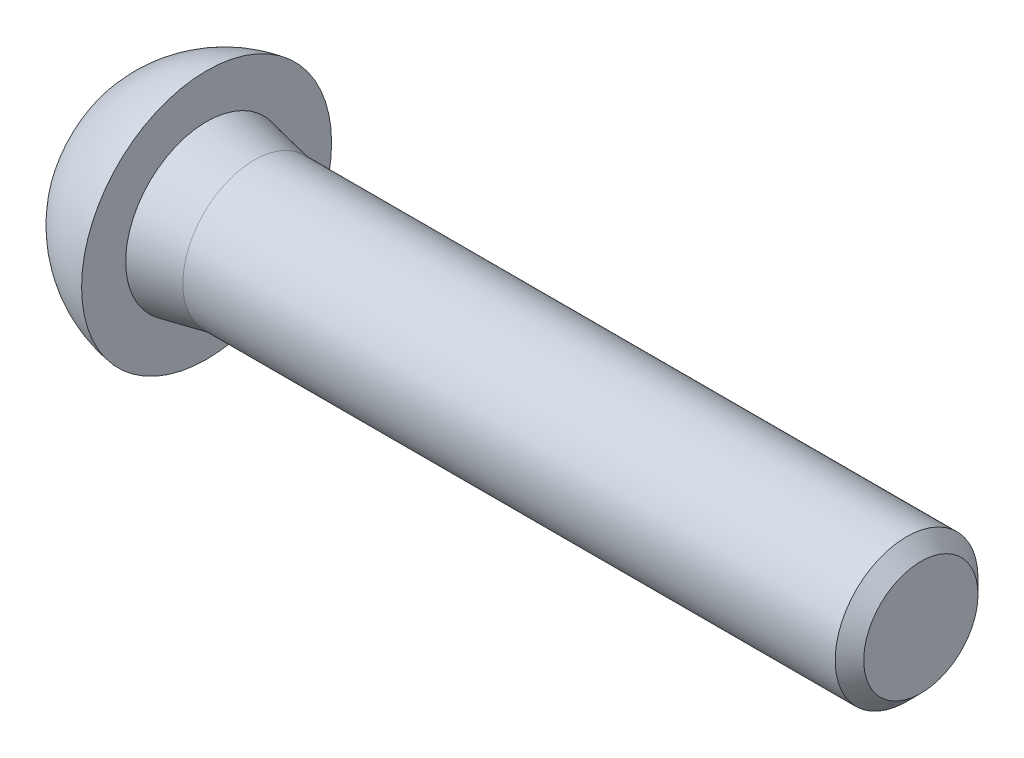
ISO-10303-21;
HEADER;
FILE_DESCRIPTION(('STEP AP214'),'2;1');
FILE_NAME('part.step','',(''),(''),'','','');
FILE_SCHEMA(('AUTOMOTIVE_DESIGN { 1 0 10303 214 1 1 1 1 }'));
ENDSEC;
DATA;
#1=APPLICATION_CONTEXT('core data for automotive mechanical design processes');
#2=APPLICATION_PROTOCOL_DEFINITION('international standard','automotive_design',2000,#1);
#3=PRODUCT_CONTEXT('',#1,'mechanical');
#4=PRODUCT('Part','Part','',(#3));
#5=PRODUCT_RELATED_PRODUCT_CATEGORY('part','',(#4));
#6=PRODUCT_DEFINITION_FORMATION('','',#4);
#7=PRODUCT_DEFINITION_CONTEXT('part definition',#1,'design');
#8=PRODUCT_DEFINITION('design','',#6,#7);
#9=PRODUCT_DEFINITION_SHAPE('','',#8);
#10=(LENGTH_UNIT() NAMED_UNIT(*) SI_UNIT(.MILLI.,.METRE.));
#11=(NAMED_UNIT(*) PLANE_ANGLE_UNIT() SI_UNIT($,.RADIAN.));
#12=(NAMED_UNIT(*) SI_UNIT($,.STERADIAN.) SOLID_ANGLE_UNIT());
#13=UNCERTAINTY_MEASURE_WITH_UNIT(LENGTH_MEASURE(1.E-05),#10,'distance_accuracy_value','');
#14=(GEOMETRIC_REPRESENTATION_CONTEXT(3) GLOBAL_UNCERTAINTY_ASSIGNED_CONTEXT((#13)) GLOBAL_UNIT_ASSIGNED_CONTEXT((#10,
#11,#12)) REPRESENTATION_CONTEXT('',''));
#15=CARTESIAN_POINT('',(0.,0.,0.));
#16=DIRECTION('',(0.,0.,1.));
#17=DIRECTION('',(1.,0.,0.));
#18=AXIS2_PLACEMENT_3D('',#15,#16,#17);
#19=CARTESIAN_POINT('',(0.,0.,0.));
#20=DIRECTION('',(1.,0.,0.));
#21=DIRECTION('',(0.,0.,-1.));
#22=AXIS2_PLACEMENT_3D('',#19,#20,#21);
#23=PLANE('',#22);
#24=CARTESIAN_POINT('',(0.,0.,0.));
#25=DIRECTION('',(1.,0.,0.));
#26=DIRECTION('',(0.,0.,-1.));
#27=AXIS2_PLACEMENT_3D('',#24,#25,#26);
#28=CIRCLE('',#27,2.4);
#29=CARTESIAN_POINT('',(0.,0.,-2.4));
#30=VERTEX_POINT('',#29);
#31=EDGE_CURVE('E68',#30,#30,#28,.T.);
#32=ORIENTED_EDGE('',*,*,#31,.T.);
#33=EDGE_LOOP('',(#32));
#34=FACE_BOUND('',#33,.T.);
#35=ADVANCED_FACE('F57',(#34),#23,.T.);
#36=CARTESIAN_POINT('',(0.,0.,0.));
#37=DIRECTION('',(1.,0.,0.));
#38=DIRECTION('',(0.,0.,-1.));
#39=AXIS2_PLACEMENT_3D('',#36,#37,#38);
#40=CYLINDRICAL_SURFACE('',#39,3.);
#41=CARTESIAN_POINT('',(-0.599999999999999,0.,0.));
#42=DIRECTION('',(1.,0.,0.));
#43=DIRECTION('',(0.,0.,-1.));
#44=AXIS2_PLACEMENT_3D('',#41,#42,#43);
#45=CIRCLE('',#44,3.);
#46=CARTESIAN_POINT('',(-0.599999999999999,0.,-3.));
#47=VERTEX_POINT('',#46);
#48=EDGE_CURVE('E12',#47,#47,#45,.F.);
#49=ORIENTED_EDGE('',*,*,#48,.T.);
#50=EDGE_LOOP('',(#49));
#51=FACE_BOUND('',#50,.T.);
#52=CARTESIAN_POINT('',(-28.,0.,0.));
#53=DIRECTION('',(1.,0.,0.));
#54=DIRECTION('',(0.,0.,-1.));
#55=AXIS2_PLACEMENT_3D('',#52,#53,#54);
#56=CIRCLE('',#55,3.);
#57=CARTESIAN_POINT('',(-28.,0.,-3.));
#58=VERTEX_POINT('',#57);
#59=EDGE_CURVE('E185',#58,#58,#56,.T.);
#60=ORIENTED_EDGE('',*,*,#59,.T.);
#61=EDGE_LOOP('',(#60));
#62=FACE_BOUND('',#61,.T.);
#63=ADVANCED_FACE('F274',(#51,#62),#40,.T.);
#64=CARTESIAN_POINT('',(-28.,0.,0.));
#65=DIRECTION('',(-1.,0.,0.));
#66=DIRECTION('',(0.,0.,1.));
#67=AXIS2_PLACEMENT_3D('',#64,#65,#66);
#68=CONICAL_SURFACE('',#67,3.,0.197395559849881);
#69=CARTESIAN_POINT('',(-30.,0.,0.));
#70=DIRECTION('',(1.,0.,0.));
#71=DIRECTION('',(0.,0.,-1.));
#72=AXIS2_PLACEMENT_3D('',#69,#70,#71);
#73=CIRCLE('',#72,3.4);
#74=CARTESIAN_POINT('',(-30.,0.,-3.4));
#75=VERTEX_POINT('',#74);
#76=EDGE_CURVE('E181',#75,#75,#73,.T.);
#77=ORIENTED_EDGE('',*,*,#76,.T.);
#78=EDGE_LOOP('',(#77));
#79=FACE_BOUND('',#78,.T.);
#80=ORIENTED_EDGE('',*,*,#59,.F.);
#81=EDGE_LOOP('',(#80));
#82=FACE_BOUND('',#81,.T.);
#83=ADVANCED_FACE('F279',(#79,#82),#68,.T.);
#84=CARTESIAN_POINT('',(-30.,3.4,0.));
#85=DIRECTION('',(1.,0.,0.));
#86=DIRECTION('',(0.,0.,-1.));
#87=AXIS2_PLACEMENT_3D('',#84,#85,#86);
#88=PLANE('',#87);
#89=CARTESIAN_POINT('',(-30.,0.,0.));
#90=DIRECTION('',(1.,0.,0.));
#91=DIRECTION('',(0.,0.,-1.));
#92=AXIS2_PLACEMENT_3D('',#89,#90,#91);
#93=CIRCLE('',#92,5.25);
#94=CARTESIAN_POINT('',(-30.,5.24999999999999,0.));
#95=VERTEX_POINT('',#94);
#96=EDGE_CURVE('E177',#95,#95,#93,.T.);
#97=ORIENTED_EDGE('',*,*,#96,.T.);
#98=EDGE_LOOP('',(#97));
#99=FACE_BOUND('',#98,.T.);
#100=ORIENTED_EDGE('',*,*,#76,.F.);
#101=EDGE_LOOP('',(#100));
#102=FACE_BOUND('',#101,.T.);
#103=ADVANCED_FACE('F285',(#99,#102),#88,.T.);
#104=CARTESIAN_POINT('',(-29.2460454545455,0.,0.));
#105=DIRECTION('',(1.,0.,0.));
#106=DIRECTION('',(0.,1.,0.));
#107=AXIS2_PLACEMENT_3D('',#104,#105,#106);
#108=SPHERICAL_SURFACE('',#107,5.30386156084522);
#109=CARTESIAN_POINT('',(-33.3,0.,0.));
#110=DIRECTION('',(1.,0.,0.));
#111=DIRECTION('',(0.,0.,-1.));
#112=AXIS2_PLACEMENT_3D('',#109,#110,#111);
#113=CIRCLE('',#112,3.42);
#114=CARTESIAN_POINT('',(-33.3,3.41999999999999,0.));
#115=VERTEX_POINT('',#114);
#116=EDGE_CURVE('E136',#115,#115,#113,.T.);
#117=CARTESIAN_POINT('',(-33.3,3.41999999999999,0.));
#118=CARTESIAN_POINT('',(-33.2740870694515,3.45071645963646,0.));
#119=CARTESIAN_POINT('',(-33.2478249112314,3.48113829921276,0.));
#120=CARTESIAN_POINT('',(-33.1946159870787,3.54137726683391,0.));
#121=CARTESIAN_POINT('',(-33.1676692211461,3.57119439487874,0.));
#122=CARTESIAN_POINT('',(-33.1131049291991,3.6302084680258,0.));
#123=CARTESIAN_POINT('',(-33.0854874031847,3.65940541312801,0.));
#124=CARTESIAN_POINT('',(-33.0295958800378,3.71716405311965,0.));
#125=CARTESIAN_POINT('',(-33.0013218829053,3.74572574800908,0.));
#126=CARTESIAN_POINT('',(-32.9441320202645,3.80219912608321,0.));
#127=CARTESIAN_POINT('',(-32.9152161547562,3.83011080926792,0.));
#128=CARTESIAN_POINT('',(-32.8567574965401,3.8852697442878,0.));
#129=CARTESIAN_POINT('',(-32.8272147038322,3.91251699612297,0.));
#130=CARTESIAN_POINT('',(-32.7675174544793,3.96633299047506,0.));
#131=CARTESIAN_POINT('',(-32.7373629978344,3.99290173299198,0.));
#132=CARTESIAN_POINT('',(-32.6764580003821,4.04534698173061,0.));
#133=CARTESIAN_POINT('',(-32.6457074595749,4.07122348795232,0.));
#134=CARTESIAN_POINT('',(-32.5836261814162,4.12227089466032,0.));
#135=CARTESIAN_POINT('',(-32.5522954440647,4.14744179514662,0.));
#136=CARTESIAN_POINT('',(-32.4890699602365,4.1970649855345,0.));
#137=CARTESIAN_POINT('',(-32.4571752137598,4.22151727543608,0.));
#138=CARTESIAN_POINT('',(-32.3928381904927,4.26969061107593,0.));
#139=CARTESIAN_POINT('',(-32.3603959137024,4.2934116568142,0.));
#140=CARTESIAN_POINT('',(-32.2949805915108,4.34011024835735,0.));
#141=CARTESIAN_POINT('',(-32.2620075461095,4.36308779416223,0.));
#142=CARTESIAN_POINT('',(-32.1955477226258,4.40828751420635,0.));
#143=CARTESIAN_POINT('',(-32.1620609445435,4.43050968844559,0.));
#144=CARTESIAN_POINT('',(-32.0945909570544,4.47418718399834,0.));
#145=CARTESIAN_POINT('',(-32.0606077476476,4.49564250531186,0.));
#146=CARTESIAN_POINT('',(-31.9921624553533,4.53777520985705,0.));
#147=CARTESIAN_POINT('',(-31.9577003724658,4.55845259308873,0.));
#148=CARTESIAN_POINT('',(-31.8883151384699,4.59901873824546,0.));
#149=CARTESIAN_POINT('',(-31.8533919873614,4.61890750017051,0.));
#150=CARTESIAN_POINT('',(-31.7831026603999,4.65788612694008,0.));
#151=CARTESIAN_POINT('',(-31.7477364845468,4.67697599178461,0.));
#152=CARTESIAN_POINT('',(-31.6765793804665,4.71434696137926,0.));
#153=CARTESIAN_POINT('',(-31.6407884522392,4.73262806612939,0.));
#154=CARTESIAN_POINT('',(-31.5688003352346,4.76837207037724,0.));
#155=CARTESIAN_POINT('',(-31.5326031464572,4.78583496987497,0.));
#156=CARTESIAN_POINT('',(-31.4598212100758,4.81993354119586,0.));
#157=CARTESIAN_POINT('',(-31.4232364624719,4.83656921301902,0.));
#158=CARTESIAN_POINT('',(-31.3496983103979,4.86900473396591,0.));
#159=CARTESIAN_POINT('',(-31.312744905928,4.88480458308965,0.));
#160=CARTESIAN_POINT('',(-31.2384885325538,4.91556029545116,0.));
#161=CARTESIAN_POINT('',(-31.2011855636496,4.93051615868894,0.));
#162=CARTESIAN_POINT('',(-31.1262493344453,4.95957617214685,0.));
#163=CARTESIAN_POINT('',(-31.0886160741452,4.97368032236697,0.));
#164=CARTESIAN_POINT('',(-31.0130387058371,5.00102962270919,0.));
#165=CARTESIAN_POINT('',(-30.9750945978292,5.01427477283129,0.));
#166=CARTESIAN_POINT('',(-30.8989151383947,5.03989922969769,0.));
#167=CARTESIAN_POINT('',(-30.8606797869681,5.05227853644201,0.));
#168=CARTESIAN_POINT('',(-30.783937595468,5.07616491066791,0.));
#169=CARTESIAN_POINT('',(-30.7454307553943,5.0876719781495,0.));
#170=CARTESIAN_POINT('',(-30.6681654816105,5.10980792844588,0.));
#171=CARTESIAN_POINT('',(-30.6294070479005,5.12043681126069,0.));
#172=CARTESIAN_POINT('',(-30.5516586119508,5.14081090118732,0.));
#173=CARTESIAN_POINT('',(-30.5126686097112,5.15055610829916,0.));
#174=CARTESIAN_POINT('',(-30.4344771810517,5.16915780994609,0.));
#175=CARTESIAN_POINT('',(-30.3952757546318,5.17801430448119,0.));
#176=CARTESIAN_POINT('',(-30.3166817326903,5.19483401222037,0.));
#177=CARTESIAN_POINT('',(-30.2772891371688,5.20279722542446,0.));
#178=CARTESIAN_POINT('',(-30.1983331252948,5.21782622985083,0.));
#179=CARTESIAN_POINT('',(-30.1587697089424,5.22489202107312,0.));
#180=CARTESIAN_POINT('',(-30.0794925127506,5.23812262927939,0.));
#181=CARTESIAN_POINT('',(-30.0397787329111,5.24428744626339,0.));
#182=CARTESIAN_POINT('',(-30.,5.24999999999999,0.));
#183=B_SPLINE_CURVE_WITH_KNOTS('',3,(#117,#118,#119,#120,#121,#122,#123,#124,#125,#126,#127,
#128,#129,#130,#131,#132,#133,#134,#135,#136,#137,#138,#139,#140,#141,#142,#143,#144,#145,#146,
#147,#148,#149,#150,#151,#152,#153,#154,#155,#156,#157,#158,#159,#160,#161,#162,#163,#164,#165,
#166,#167,#168,#169,#170,#171,#172,#173,#174,#175,#176,#177,#178,#179,#180,#181,#182),
.UNSPECIFIED.,.F.,.F.,(4,2,2,2,2,2,2,2,2,2,2,2,2,2,2,2,2,2,2,2,2,2,2,2,2,2,2,2,2,2,2,2,4),(0.,
0.120557872383619,0.241115744767231,0.361673617150846,0.48223148953446,0.602789361918079,
0.723347234301694,0.843905106685309,0.964462979068919,1.08502085145253,1.20557872383615,
1.32613659621977,1.44669446860338,1.567252340987,1.68781021337061,1.80836808575423,
1.92892595813784,2.04948383052146,2.17004170290507,2.29059957528869,2.4111574476723,
2.53171532005592,2.65227319243953,2.77283106482314,2.89338893720676,3.01394680959038,
3.13450468197399,3.25506255435761,3.37562042674122,3.49617829912484,3.61673617150845,
3.73729404389207,3.85785191627568),.UNSPECIFIED.);
#184=EDGE_CURVE('BSEAM289',#115,#95,#183,.T.);
#185=ORIENTED_EDGE('',*,*,#116,.T.);
#186=ORIENTED_EDGE('',*,*,#96,.F.);
#187=ORIENTED_EDGE('',*,*,#184,.T.);
#188=ORIENTED_EDGE('',*,*,#184,.F.);
#189=EDGE_LOOP('',(#185,#187,#186,#188));
#190=FACE_BOUND('',#189,.T.);
#191=ADVANCED_FACE('F289',(#190),#108,.T.);
#192=CARTESIAN_POINT('',(-33.3,3.42,0.));
#193=DIRECTION('',(-1.,0.,0.));
#194=DIRECTION('',(0.,0.,1.));
#195=AXIS2_PLACEMENT_3D('',#192,#193,#194);
#196=PLANE('',#195);
#197=DIRECTION('',(0.,0.5,-0.866025403784439));
#198=VECTOR('',#197,1.);
#199=CARTESIAN_POINT('',(-33.3,1.15470053837925,2.));
#200=LINE('',#199,#198);
#201=CARTESIAN_POINT('',(-33.3,1.15470053837925,2.));
#202=VERTEX_POINT('',#201);
#203=CARTESIAN_POINT('',(-33.3,2.3094010767585,0.));
#204=VERTEX_POINT('',#203);
#205=EDGE_CURVE('E77',#202,#204,#200,.T.);
#206=ORIENTED_EDGE('',*,*,#205,.F.);
#207=DIRECTION('',(0.,1.,0.));
#208=VECTOR('',#207,1.);
#209=CARTESIAN_POINT('',(-33.3,-1.15470053837925,2.));
#210=LINE('',#209,#208);
#211=CARTESIAN_POINT('',(-33.3,-1.15470053837925,2.));
#212=VERTEX_POINT('',#211);
#213=EDGE_CURVE('E139',#212,#202,#210,.T.);
#214=ORIENTED_EDGE('',*,*,#213,.F.);
#215=DIRECTION('',(0.,0.5,0.866025403784439));
#216=VECTOR('',#215,1.);
#217=CARTESIAN_POINT('',(-33.3,-2.3094010767585,0.));
#218=LINE('',#217,#216);
#219=CARTESIAN_POINT('',(-33.3,-2.3094010767585,0.));
#220=VERTEX_POINT('',#219);
#221=EDGE_CURVE('E144',#220,#212,#218,.T.);
#222=ORIENTED_EDGE('',*,*,#221,.F.);
#223=DIRECTION('',(0.,-0.5,0.866025403784439));
#224=VECTOR('',#223,1.);
#225=CARTESIAN_POINT('',(-33.3,-1.15470053837925,-2.));
#226=LINE('',#225,#224);
#227=CARTESIAN_POINT('',(-33.3,-1.15470053837925,-2.));
#228=VERTEX_POINT('',#227);
#229=EDGE_CURVE('E168',#228,#220,#226,.T.);
#230=ORIENTED_EDGE('',*,*,#229,.F.);
#231=DIRECTION('',(0.,-1.,0.));
#232=VECTOR('',#231,1.);
#233=CARTESIAN_POINT('',(-33.3,1.15470053837925,-2.));
#234=LINE('',#233,#232);
#235=CARTESIAN_POINT('',(-33.3,1.15470053837925,-2.));
#236=VERTEX_POINT('',#235);
#237=EDGE_CURVE('E159',#236,#228,#234,.T.);
#238=ORIENTED_EDGE('',*,*,#237,.F.);
#239=DIRECTION('',(0.,-0.5,-0.866025403784439));
#240=VECTOR('',#239,1.);
#241=CARTESIAN_POINT('',(-33.3,2.3094010767585,0.));
#242=LINE('',#241,#240);
#243=EDGE_CURVE('E151',#204,#236,#242,.T.);
#244=ORIENTED_EDGE('',*,*,#243,.F.);
#245=EDGE_LOOP('',(#206,#214,#222,#230,#238,#244));
#246=FACE_BOUND('',#245,.T.);
#247=ORIENTED_EDGE('',*,*,#116,.F.);
#248=EDGE_LOOP('',(#247));
#249=FACE_BOUND('',#248,.T.);
#250=ADVANCED_FACE('F147',(#246,#249),#196,.T.);
#251=CARTESIAN_POINT('',(-31.22,1.15470053837925,2.));
#252=DIRECTION('',(0.,0.866025403784439,0.5));
#253=DIRECTION('',(0.,-0.5,0.866025403784439));
#254=AXIS2_PLACEMENT_3D('',#251,#252,#253);
#255=PLANE('',#254);
#256=ORIENTED_EDGE('',*,*,#205,.T.);
#257=DIRECTION('',(-1.,0.,0.));
#258=VECTOR('',#257,1.);
#259=CARTESIAN_POINT('',(-31.22,2.3094010767585,0.));
#260=LINE('',#259,#258);
#261=CARTESIAN_POINT('',(-31.22,2.3094010767585,0.));
#262=VERTEX_POINT('',#261);
#263=EDGE_CURVE('E195',#262,#204,#260,.T.);
#264=ORIENTED_EDGE('',*,*,#263,.F.);
#265=DIRECTION('',(0.,-0.5,0.866025403784438));
#266=VECTOR('',#265,1.);
#267=CARTESIAN_POINT('',(-31.22,2.3094010767585,0.));
#268=LINE('',#267,#266);
#269=CARTESIAN_POINT('',(-31.22,1.15470053837925,2.));
#270=VERTEX_POINT('',#269);
#271=EDGE_CURVE('E61',#270,#262,#268,.F.);
#272=ORIENTED_EDGE('',*,*,#271,.F.);
#273=DIRECTION('',(-1.,0.,0.));
#274=VECTOR('',#273,1.);
#275=CARTESIAN_POINT('',(-31.22,1.15470053837925,2.));
#276=LINE('',#275,#274);
#277=EDGE_CURVE('E133',#270,#202,#276,.T.);
#278=ORIENTED_EDGE('',*,*,#277,.T.);
#279=EDGE_LOOP('',(#256,#264,#272,#278));
#280=FACE_BOUND('',#279,.T.);
#281=ADVANCED_FACE('F134',(#280),#255,.F.);
#282=CARTESIAN_POINT('',(-31.22,-1.15470053837925,2.));
#283=DIRECTION('',(0.,0.,1.));
#284=DIRECTION('',(1.,0.,0.));
#285=AXIS2_PLACEMENT_3D('',#282,#283,#284);
#286=PLANE('',#285);
#287=ORIENTED_EDGE('',*,*,#213,.T.);
#288=ORIENTED_EDGE('',*,*,#277,.F.);
#289=DIRECTION('',(0.,1.,0.));
#290=VECTOR('',#289,1.);
#291=CARTESIAN_POINT('',(-31.22,0.,2.));
#292=LINE('',#291,#290);
#293=CARTESIAN_POINT('',(-31.22,-1.15470053837925,2.));
#294=VERTEX_POINT('',#293);
#295=EDGE_CURVE('E101',#294,#270,#292,.T.);
#296=ORIENTED_EDGE('',*,*,#295,.F.);
#297=DIRECTION('',(-1.,0.,0.));
#298=VECTOR('',#297,1.);
#299=CARTESIAN_POINT('',(-31.22,-1.15470053837925,2.));
#300=LINE('',#299,#298);
#301=EDGE_CURVE('E129',#294,#212,#300,.T.);
#302=ORIENTED_EDGE('',*,*,#301,.T.);
#303=EDGE_LOOP('',(#287,#288,#296,#302));
#304=FACE_BOUND('',#303,.T.);
#305=ADVANCED_FACE('F140',(#304),#286,.F.);
#306=CARTESIAN_POINT('',(-31.22,-2.3094010767585,0.));
#307=DIRECTION('',(0.,-0.866025403784439,0.5));
#308=DIRECTION('',(0.,-0.5,-0.866025403784439));
#309=AXIS2_PLACEMENT_3D('',#306,#307,#308);
#310=PLANE('',#309);
#311=ORIENTED_EDGE('',*,*,#221,.T.);
#312=ORIENTED_EDGE('',*,*,#301,.F.);
#313=DIRECTION('',(0.,-0.5,-0.866025403784439));
#314=VECTOR('',#313,1.);
#315=CARTESIAN_POINT('',(-31.22,-1.15470053837925,2.));
#316=LINE('',#315,#314);
#317=CARTESIAN_POINT('',(-31.22,-2.3094010767585,0.));
#318=VERTEX_POINT('',#317);
#319=EDGE_CURVE('E208',#318,#294,#316,.F.);
#320=ORIENTED_EDGE('',*,*,#319,.F.);
#321=DIRECTION('',(-1.,0.,0.));
#322=VECTOR('',#321,1.);
#323=CARTESIAN_POINT('',(-31.22,-2.3094010767585,0.));
#324=LINE('',#323,#322);
#325=EDGE_CURVE('E193',#318,#220,#324,.T.);
#326=ORIENTED_EDGE('',*,*,#325,.T.);
#327=EDGE_LOOP('',(#311,#312,#320,#326));
#328=FACE_BOUND('',#327,.T.);
#329=ADVANCED_FACE('F264',(#328),#310,.F.);
#330=CARTESIAN_POINT('',(-31.22,-1.15470053837925,-2.));
#331=DIRECTION('',(0.,-0.866025403784439,-0.5));
#332=DIRECTION('',(0.,0.5,-0.866025403784439));
#333=AXIS2_PLACEMENT_3D('',#330,#331,#332);
#334=PLANE('',#333);
#335=ORIENTED_EDGE('',*,*,#229,.T.);
#336=ORIENTED_EDGE('',*,*,#325,.F.);
#337=DIRECTION('',(0.,0.500000000000001,-0.866025403784438));
#338=VECTOR('',#337,1.);
#339=CARTESIAN_POINT('',(-31.22,-2.3094010767585,0.));
#340=LINE('',#339,#338);
#341=CARTESIAN_POINT('',(-31.22,-1.15470053837925,-2.));
#342=VERTEX_POINT('',#341);
#343=EDGE_CURVE('E211',#342,#318,#340,.F.);
#344=ORIENTED_EDGE('',*,*,#343,.F.);
#345=DIRECTION('',(-1.,0.,0.));
#346=VECTOR('',#345,1.);
#347=CARTESIAN_POINT('',(-31.22,-1.15470053837925,-2.));
#348=LINE('',#347,#346);
#349=EDGE_CURVE('E201',#342,#228,#348,.T.);
#350=ORIENTED_EDGE('',*,*,#349,.T.);
#351=EDGE_LOOP('',(#335,#336,#344,#350));
#352=FACE_BOUND('',#351,.T.);
#353=ADVANCED_FACE('F261',(#352),#334,.F.);
#354=CARTESIAN_POINT('',(-31.22,1.15470053837925,-2.));
#355=DIRECTION('',(0.,0.,-1.));
#356=DIRECTION('',(-1.,0.,0.));
#357=AXIS2_PLACEMENT_3D('',#354,#355,#356);
#358=PLANE('',#357);
#359=ORIENTED_EDGE('',*,*,#237,.T.);
#360=ORIENTED_EDGE('',*,*,#349,.F.);
#361=DIRECTION('',(0.,1.,0.));
#362=VECTOR('',#361,1.);
#363=CARTESIAN_POINT('',(-31.22,0.,-2.));
#364=LINE('',#363,#362);
#365=CARTESIAN_POINT('',(-31.22,1.15470053837925,-2.));
#366=VERTEX_POINT('',#365);
#367=EDGE_CURVE('E214',#366,#342,#364,.F.);
#368=ORIENTED_EDGE('',*,*,#367,.F.);
#369=DIRECTION('',(-1.,0.,0.));
#370=VECTOR('',#369,1.);
#371=CARTESIAN_POINT('',(-31.22,1.15470053837925,-2.));
#372=LINE('',#371,#370);
#373=EDGE_CURVE('E198',#366,#236,#372,.T.);
#374=ORIENTED_EDGE('',*,*,#373,.T.);
#375=EDGE_LOOP('',(#359,#360,#368,#374));
#376=FACE_BOUND('',#375,.T.);
#377=ADVANCED_FACE('F233',(#376),#358,.F.);
#378=CARTESIAN_POINT('',(-31.22,2.3094010767585,0.));
#379=DIRECTION('',(0.,0.866025403784439,-0.5));
#380=DIRECTION('',(0.,0.5,0.866025403784439));
#381=AXIS2_PLACEMENT_3D('',#378,#379,#380);
#382=PLANE('',#381);
#383=ORIENTED_EDGE('',*,*,#243,.T.);
#384=ORIENTED_EDGE('',*,*,#373,.F.);
#385=DIRECTION('',(0.,0.5,0.866025403784439));
#386=VECTOR('',#385,1.);
#387=CARTESIAN_POINT('',(-31.22,1.15470053837925,-2.));
#388=LINE('',#387,#386);
#389=EDGE_CURVE('E217',#262,#366,#388,.F.);
#390=ORIENTED_EDGE('',*,*,#389,.F.);
#391=ORIENTED_EDGE('',*,*,#263,.T.);
#392=EDGE_LOOP('',(#383,#384,#390,#391));
#393=FACE_BOUND('',#392,.T.);
#394=ADVANCED_FACE('F229',(#393),#382,.F.);
#395=CARTESIAN_POINT('',(0.,0.,0.));
#396=DIRECTION('',(-1.,0.,0.));
#397=DIRECTION('',(0.,0.,1.));
#398=AXIS2_PLACEMENT_3D('',#395,#396,#397);
#399=CONICAL_SURFACE('',#398,2.4,0.785398163397448);
#400=ORIENTED_EDGE('',*,*,#48,.F.);
#401=EDGE_LOOP('',(#400));
#402=FACE_BOUND('',#401,.T.);
#403=ORIENTED_EDGE('',*,*,#31,.F.);
#404=EDGE_LOOP('',(#403));
#405=FACE_BOUND('',#404,.T.);
#406=ADVANCED_FACE('F59',(#402,#405),#399,.T.);
#407=CARTESIAN_POINT('',(-29.5504514968714,-5.27823484847804,-3.04739031061486));
#408=DIRECTION('',(-0.979385865114737,-0.174935689354957,-0.100999167339957));
#409=DIRECTION('',(0.175834818906266,-0.984419685124287,0.));
#410=AXIS2_PLACEMENT_3D('',#407,#408,#409);
#411=PLANE('',#410);
#412=DIRECTION('',(-0.175834818906266,0.984419685124287,0.));
#413=VECTOR('',#412,1.);
#414=CARTESIAN_POINT('',(-30.8075,0.,0.));
#415=LINE('',#414,#413);
#416=CARTESIAN_POINT('',(-30.8075,0.,0.));
#417=VERTEX_POINT('',#416);
#418=EDGE_CURVE('E111',#417,#262,#415,.T.);
#419=ORIENTED_EDGE('',*,*,#418,.F.);
#420=DIRECTION('',(-0.175834818906266,0.492209842562143,0.852532455303111));
#421=VECTOR('',#420,1.);
#422=CARTESIAN_POINT('',(-30.8075,0.,0.));
#423=LINE('',#422,#421);
#424=EDGE_CURVE('E153',#417,#270,#423,.T.);
#425=ORIENTED_EDGE('',*,*,#424,.T.);
#426=ORIENTED_EDGE('',*,*,#271,.T.);
#427=EDGE_LOOP('',(#419,#425,#426));
#428=FACE_BOUND('',#427,.T.);
#429=ADVANCED_FACE('F227',(#428),#411,.T.);
#430=CARTESIAN_POINT('',(-29.5504514968714,0.,-6.09478062122972));
#431=DIRECTION('',(-0.979385865114737,0.,-0.201998334679914));
#432=DIRECTION('',(-0.201998334679914,0.,0.979385865114737));
#433=AXIS2_PLACEMENT_3D('',#430,#431,#432);
#434=PLANE('',#433);
#435=ORIENTED_EDGE('',*,*,#424,.F.);
#436=DIRECTION('',(-0.175834818906266,-0.492209842562144,0.85253245530311));
#437=VECTOR('',#436,1.);
#438=CARTESIAN_POINT('',(-30.8075,0.,0.));
#439=LINE('',#438,#437);
#440=EDGE_CURVE('E247',#417,#294,#439,.T.);
#441=ORIENTED_EDGE('',*,*,#440,.T.);
#442=ORIENTED_EDGE('',*,*,#295,.T.);
#443=EDGE_LOOP('',(#435,#441,#442));
#444=FACE_BOUND('',#443,.T.);
#445=ADVANCED_FACE('F318',(#444),#434,.T.);
#446=CARTESIAN_POINT('',(-29.5504514968714,-5.27823484847804,3.04739031061485));
#447=DIRECTION('',(-0.979385865114737,-0.174935689354957,0.100999167339957));
#448=DIRECTION('',(0.175834818906266,-0.984419685124287,0.));
#449=AXIS2_PLACEMENT_3D('',#446,#447,#448);
#450=PLANE('',#449);
#451=DIRECTION('',(-0.175834818906266,0.492209842562144,-0.85253245530311));
#452=VECTOR('',#451,1.);
#453=CARTESIAN_POINT('',(-30.8075,0.,0.));
#454=LINE('',#453,#452);
#455=EDGE_CURVE('E238',#417,#366,#454,.T.);
#456=ORIENTED_EDGE('',*,*,#455,.F.);
#457=ORIENTED_EDGE('',*,*,#418,.T.);
#458=ORIENTED_EDGE('',*,*,#389,.T.);
#459=EDGE_LOOP('',(#456,#457,#458));
#460=FACE_BOUND('',#459,.T.);
#461=ADVANCED_FACE('F324',(#460),#450,.T.);
#462=CARTESIAN_POINT('',(-29.5504514968714,0.,6.09478062122972));
#463=DIRECTION('',(-0.979385865114737,0.,0.201998334679914));
#464=DIRECTION('',(0.201998334679914,0.,0.979385865114737));
#465=AXIS2_PLACEMENT_3D('',#462,#463,#464);
#466=PLANE('',#465);
#467=DIRECTION('',(-0.175834818906267,-0.492209842562143,-0.852532455303111));
#468=VECTOR('',#467,1.);
#469=CARTESIAN_POINT('',(-30.8075,0.,0.));
#470=LINE('',#469,#468);
#471=EDGE_CURVE('E237',#417,#342,#470,.T.);
#472=ORIENTED_EDGE('',*,*,#471,.F.);
#473=ORIENTED_EDGE('',*,*,#455,.T.);
#474=ORIENTED_EDGE('',*,*,#367,.T.);
#475=EDGE_LOOP('',(#472,#473,#474));
#476=FACE_BOUND('',#475,.T.);
#477=ADVANCED_FACE('F236',(#476),#466,.T.);
#478=CARTESIAN_POINT('',(-29.5504514968714,5.27823484847804,3.04739031061486));
#479=DIRECTION('',(-0.979385865114737,0.174935689354957,0.100999167339957));
#480=DIRECTION('',(-0.175834818906266,-0.984419685124287,0.));
#481=AXIS2_PLACEMENT_3D('',#478,#479,#480);
#482=PLANE('',#481);
#483=DIRECTION('',(-0.175834818906267,-0.984419685124287,0.));
#484=VECTOR('',#483,1.);
#485=CARTESIAN_POINT('',(-30.8075,0.,0.));
#486=LINE('',#485,#484);
#487=EDGE_CURVE('E117',#417,#318,#486,.T.);
#488=ORIENTED_EDGE('',*,*,#487,.F.);
#489=ORIENTED_EDGE('',*,*,#471,.T.);
#490=ORIENTED_EDGE('',*,*,#343,.T.);
#491=EDGE_LOOP('',(#488,#489,#490));
#492=FACE_BOUND('',#491,.T.);
#493=ADVANCED_FACE('F259',(#492),#482,.T.);
#494=CARTESIAN_POINT('',(-29.5504514968714,5.27823484847804,-3.04739031061486));
#495=DIRECTION('',(-0.979385865114737,0.174935689354957,-0.100999167339957));
#496=DIRECTION('',(-0.175834818906266,-0.984419685124287,0.));
#497=AXIS2_PLACEMENT_3D('',#494,#495,#496);
#498=PLANE('',#497);
#499=ORIENTED_EDGE('',*,*,#440,.F.);
#500=ORIENTED_EDGE('',*,*,#487,.T.);
#501=ORIENTED_EDGE('',*,*,#319,.T.);
#502=EDGE_LOOP('',(#499,#500,#501));
#503=FACE_BOUND('',#502,.T.);
#504=ADVANCED_FACE('F256',(#503),#498,.T.);
#505=CLOSED_SHELL('',(#35,#63,#83,#103,#191,#250,#281,#305,#329,#353,#377,#394,#406,#429,#445,
#461,#477,#493,#504));
#506=MANIFOLD_SOLID_BREP('B2',#505);
#507=ADVANCED_BREP_SHAPE_REPRESENTATION('',(#18,#506),#14);
#508=SHAPE_DEFINITION_REPRESENTATION(#9,#507);
ENDSEC;
END-ISO-10303-21;
